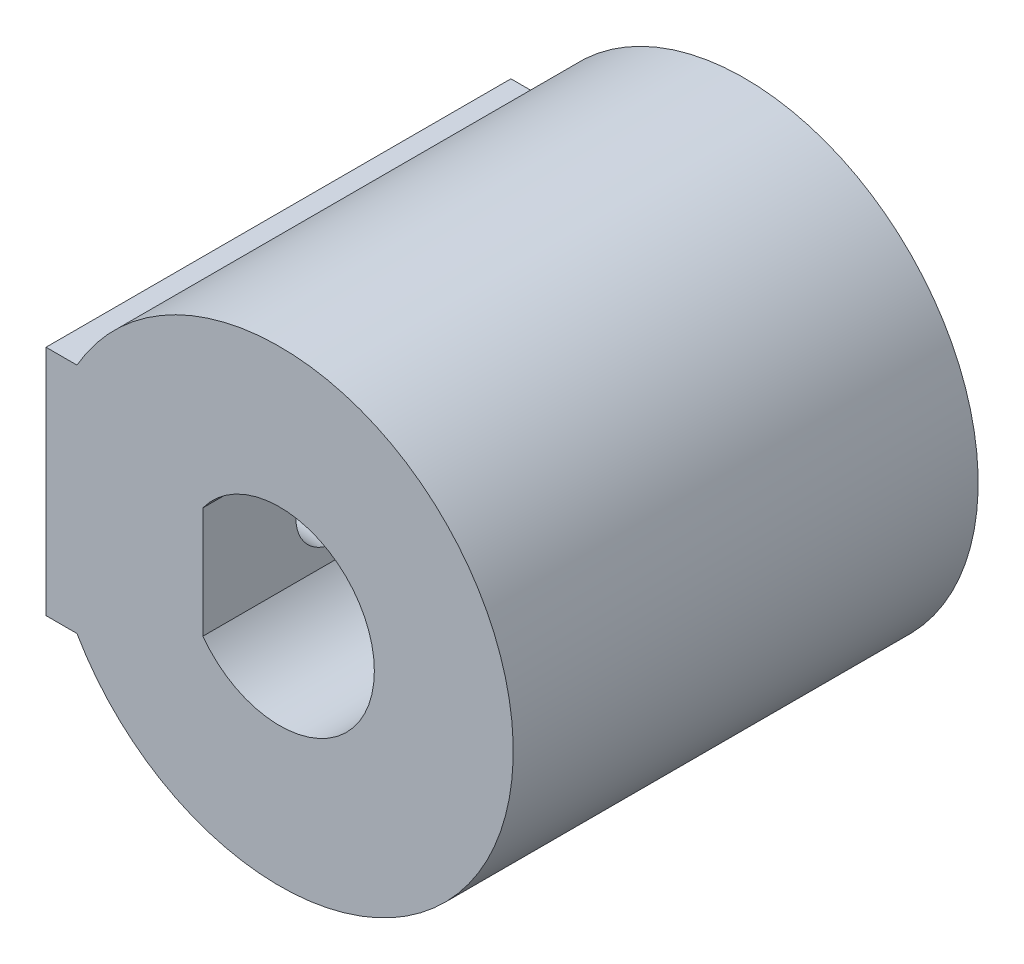
ISO-10303-21;
HEADER;
FILE_DESCRIPTION(('STEP AP214'),'2;1');
FILE_NAME('part.step','',(''),(''),'','','');
FILE_SCHEMA(('AUTOMOTIVE_DESIGN { 1 0 10303 214 1 1 1 1 }'));
ENDSEC;
DATA;
#1=APPLICATION_CONTEXT('core data for automotive mechanical design processes');
#2=APPLICATION_PROTOCOL_DEFINITION('international standard','automotive_design',2000,#1);
#3=PRODUCT_CONTEXT('',#1,'mechanical');
#4=PRODUCT('Part','Part','',(#3));
#5=PRODUCT_RELATED_PRODUCT_CATEGORY('part','',(#4));
#6=PRODUCT_DEFINITION_FORMATION('','',#4);
#7=PRODUCT_DEFINITION_CONTEXT('part definition',#1,'design');
#8=PRODUCT_DEFINITION('design','',#6,#7);
#9=PRODUCT_DEFINITION_SHAPE('','',#8);
#10=(LENGTH_UNIT() NAMED_UNIT(*) SI_UNIT(.MILLI.,.METRE.));
#11=(NAMED_UNIT(*) PLANE_ANGLE_UNIT() SI_UNIT($,.RADIAN.));
#12=(NAMED_UNIT(*) SI_UNIT($,.STERADIAN.) SOLID_ANGLE_UNIT());
#13=UNCERTAINTY_MEASURE_WITH_UNIT(LENGTH_MEASURE(1.E-05),#10,'distance_accuracy_value','');
#14=(GEOMETRIC_REPRESENTATION_CONTEXT(3) GLOBAL_UNCERTAINTY_ASSIGNED_CONTEXT((#13)) GLOBAL_UNIT_ASSIGNED_CONTEXT((#10,
#11,#12)) REPRESENTATION_CONTEXT('',''));
#15=CARTESIAN_POINT('',(0.,0.,0.));
#16=DIRECTION('',(0.,0.,1.));
#17=DIRECTION('',(1.,0.,0.));
#18=AXIS2_PLACEMENT_3D('',#15,#16,#17);
#19=CARTESIAN_POINT('',(1.6,-2.1,8.5));
#20=DIRECTION('',(1.,0.,0.));
#21=DIRECTION('',(0.,0.,-1.));
#22=AXIS2_PLACEMENT_3D('',#19,#20,#21);
#23=PLANE('',#22);
#24=DIRECTION('',(0.,1.,0.));
#25=VECTOR('',#24,1.);
#26=CARTESIAN_POINT('',(1.6,0.,3.));
#27=LINE('',#26,#25);
#28=CARTESIAN_POINT('',(1.6,-2.1,3.));
#29=VERTEX_POINT('',#28);
#30=CARTESIAN_POINT('',(1.6,2.1,3.));
#31=VERTEX_POINT('',#30);
#32=EDGE_CURVE('E188',#29,#31,#27,.T.);
#33=ORIENTED_EDGE('',*,*,#32,.F.);
#34=DIRECTION('',(0.,0.,-1.));
#35=VECTOR('',#34,1.);
#36=CARTESIAN_POINT('',(1.6,-2.1,8.5));
#37=LINE('',#36,#35);
#38=CARTESIAN_POINT('',(1.6,-2.1,8.5));
#39=VERTEX_POINT('',#38);
#40=EDGE_CURVE('E226',#39,#29,#37,.T.);
#41=ORIENTED_EDGE('',*,*,#40,.F.);
#42=DIRECTION('',(0.,-1.,0.));
#43=VECTOR('',#42,1.);
#44=CARTESIAN_POINT('',(1.6,-2.1,8.5));
#45=LINE('',#44,#43);
#46=CARTESIAN_POINT('',(1.6,2.1,8.5));
#47=VERTEX_POINT('',#46);
#48=EDGE_CURVE('E219',#47,#39,#45,.T.);
#49=ORIENTED_EDGE('',*,*,#48,.F.);
#50=DIRECTION('',(0.,0.,-1.));
#51=VECTOR('',#50,1.);
#52=CARTESIAN_POINT('',(1.6,2.1,8.5));
#53=LINE('',#52,#51);
#54=EDGE_CURVE('E229',#47,#31,#53,.T.);
#55=ORIENTED_EDGE('',*,*,#54,.T.);
#56=EDGE_LOOP('',(#33,#41,#49,#55));
#57=FACE_BOUND('',#56,.T.);
#58=ADVANCED_FACE('F44',(#57),#23,.F.);
#59=CARTESIAN_POINT('',(-1.6,2.1,8.5));
#60=DIRECTION('',(-1.,0.,0.));
#61=DIRECTION('',(0.,0.,1.));
#62=AXIS2_PLACEMENT_3D('',#59,#60,#61);
#63=PLANE('',#62);
#64=CARTESIAN_POINT('',(-1.6,0.,5.75));
#65=DIRECTION('',(-1.,0.,0.));
#66=DIRECTION('',(0.,0.,1.));
#67=AXIS2_PLACEMENT_3D('',#64,#65,#66);
#68=CIRCLE('',#67,1.75);
#69=CARTESIAN_POINT('',(-1.6,0.,7.5));
#70=VERTEX_POINT('',#69);
#71=EDGE_CURVE('E156',#70,#70,#68,.F.);
#72=ORIENTED_EDGE('',*,*,#71,.F.);
#73=EDGE_LOOP('',(#72));
#74=FACE_BOUND('',#73,.T.);
#75=DIRECTION('',(0.,-1.,0.));
#76=VECTOR('',#75,1.);
#77=CARTESIAN_POINT('',(-1.6,0.,3.));
#78=LINE('',#77,#76);
#79=CARTESIAN_POINT('',(-1.6,2.1,3.));
#80=VERTEX_POINT('',#79);
#81=CARTESIAN_POINT('',(-1.6,-2.1,3.));
#82=VERTEX_POINT('',#81);
#83=EDGE_CURVE('E203',#80,#82,#78,.T.);
#84=ORIENTED_EDGE('',*,*,#83,.F.);
#85=DIRECTION('',(0.,0.,-1.));
#86=VECTOR('',#85,1.);
#87=CARTESIAN_POINT('',(-1.6,2.1,8.5));
#88=LINE('',#87,#86);
#89=CARTESIAN_POINT('',(-1.6,2.1,8.5));
#90=VERTEX_POINT('',#89);
#91=EDGE_CURVE('E232',#90,#80,#88,.T.);
#92=ORIENTED_EDGE('',*,*,#91,.F.);
#93=DIRECTION('',(0.,1.,0.));
#94=VECTOR('',#93,1.);
#95=CARTESIAN_POINT('',(-1.6,2.1,8.5));
#96=LINE('',#95,#94);
#97=CARTESIAN_POINT('',(-1.6,-2.1,8.5));
#98=VERTEX_POINT('',#97);
#99=EDGE_CURVE('E214',#98,#90,#96,.T.);
#100=ORIENTED_EDGE('',*,*,#99,.F.);
#101=DIRECTION('',(0.,0.,-1.));
#102=VECTOR('',#101,1.);
#103=CARTESIAN_POINT('',(-1.6,-2.1,8.5));
#104=LINE('',#103,#102);
#105=EDGE_CURVE('E221',#98,#82,#104,.T.);
#106=ORIENTED_EDGE('',*,*,#105,.T.);
#107=EDGE_LOOP('',(#84,#92,#100,#106));
#108=FACE_BOUND('',#107,.T.);
#109=ADVANCED_FACE('F292',(#74,#108),#63,.F.);
#110=CARTESIAN_POINT('',(0.,0.,20.));
#111=DIRECTION('',(0.,0.,-1.));
#112=DIRECTION('',(-1.,0.,0.));
#113=AXIS2_PLACEMENT_3D('',#110,#111,#112);
#114=CYLINDRICAL_SURFACE('',#113,10.05);
#115=CARTESIAN_POINT('',(0.,0.,20.));
#116=DIRECTION('',(0.,0.,1.));
#117=DIRECTION('',(1.,0.,0.));
#118=AXIS2_PLACEMENT_3D('',#115,#116,#117);
#119=CIRCLE('',#118,10.05);
#120=CARTESIAN_POINT('',(-8.71794127073588,-5.,20.));
#121=VERTEX_POINT('',#120);
#122=CARTESIAN_POINT('',(-8.71794127073588,5.,20.));
#123=VERTEX_POINT('',#122);
#124=EDGE_CURVE('E60',#121,#123,#119,.T.);
#125=ORIENTED_EDGE('',*,*,#124,.F.);
#126=DIRECTION('',(0.,0.,-1.));
#127=VECTOR('',#126,1.);
#128=CARTESIAN_POINT('',(-8.71794127073588,-5.,20.));
#129=LINE('',#128,#127);
#130=CARTESIAN_POINT('',(-8.71794127073588,-5.,0.));
#131=VERTEX_POINT('',#130);
#132=EDGE_CURVE('E155',#131,#121,#129,.F.);
#133=ORIENTED_EDGE('',*,*,#132,.F.);
#134=CARTESIAN_POINT('',(0.,0.,0.));
#135=DIRECTION('',(0.,0.,1.));
#136=DIRECTION('',(1.,0.,0.));
#137=AXIS2_PLACEMENT_3D('',#134,#135,#136);
#138=CIRCLE('',#137,10.05);
#139=CARTESIAN_POINT('',(-8.71794127073588,5.,0.));
#140=VERTEX_POINT('',#139);
#141=EDGE_CURVE('E67',#131,#140,#138,.T.);
#142=ORIENTED_EDGE('',*,*,#141,.T.);
#143=DIRECTION('',(0.,0.,-1.));
#144=VECTOR('',#143,1.);
#145=CARTESIAN_POINT('',(-8.71794127073588,5.,20.));
#146=LINE('',#145,#144);
#147=EDGE_CURVE('E167',#123,#140,#146,.T.);
#148=ORIENTED_EDGE('',*,*,#147,.F.);
#149=EDGE_LOOP('',(#125,#133,#142,#148));
#150=FACE_BOUND('',#149,.T.);
#151=ADVANCED_FACE('F328',(#150),#114,.T.);
#152=CARTESIAN_POINT('',(0.,0.,20.));
#153=DIRECTION('',(0.,0.,1.));
#154=DIRECTION('',(1.,0.,0.));
#155=AXIS2_PLACEMENT_3D('',#152,#153,#154);
#156=PLANE('',#155);
#157=DIRECTION('',(0.,-1.,0.));
#158=VECTOR('',#157,1.);
#159=CARTESIAN_POINT('',(-3.3,0.,20.));
#160=LINE('',#159,#158);
#161=CARTESIAN_POINT('',(-3.3,2.39073733396206,20.));
#162=VERTEX_POINT('',#161);
#163=CARTESIAN_POINT('',(-3.3,-2.39073733396206,20.));
#164=VERTEX_POINT('',#163);
#165=EDGE_CURVE('E172',#162,#164,#160,.T.);
#166=ORIENTED_EDGE('',*,*,#165,.F.);
#167=CARTESIAN_POINT('',(0.,0.,20.));
#168=DIRECTION('',(0.,0.,1.));
#169=DIRECTION('',(1.,0.,0.));
#170=AXIS2_PLACEMENT_3D('',#167,#168,#169);
#171=CIRCLE('',#170,4.075);
#172=EDGE_CURVE('E179',#164,#162,#171,.T.);
#173=ORIENTED_EDGE('',*,*,#172,.F.);
#174=EDGE_LOOP('',(#166,#173));
#175=FACE_BOUND('',#174,.T.);
#176=DIRECTION('',(0.,1.,0.));
#177=VECTOR('',#176,1.);
#178=CARTESIAN_POINT('',(-10.05,5.,20.));
#179=LINE('',#178,#177);
#180=CARTESIAN_POINT('',(-10.05,-5.,20.));
#181=VERTEX_POINT('',#180);
#182=CARTESIAN_POINT('',(-10.05,5.,20.));
#183=VERTEX_POINT('',#182);
#184=EDGE_CURVE('E145',#181,#183,#179,.T.);
#185=ORIENTED_EDGE('',*,*,#184,.F.);
#186=DIRECTION('',(-1.,0.,0.));
#187=VECTOR('',#186,1.);
#188=CARTESIAN_POINT('',(10.051,-5.,20.));
#189=LINE('',#188,#187);
#190=EDGE_CURVE('E151',#121,#181,#189,.T.);
#191=ORIENTED_EDGE('',*,*,#190,.F.);
#192=ORIENTED_EDGE('',*,*,#124,.T.);
#193=DIRECTION('',(-1.,0.,0.));
#194=VECTOR('',#193,1.);
#195=CARTESIAN_POINT('',(10.051,5.,20.));
#196=LINE('',#195,#194);
#197=EDGE_CURVE('E165',#123,#183,#196,.T.);
#198=ORIENTED_EDGE('',*,*,#197,.T.);
#199=EDGE_LOOP('',(#185,#191,#192,#198));
#200=FACE_BOUND('',#199,.T.);
#201=ADVANCED_FACE('F335',(#175,#200),#156,.T.);
#202=CARTESIAN_POINT('',(0.,0.,0.));
#203=DIRECTION('',(0.,0.,1.));
#204=DIRECTION('',(1.,0.,0.));
#205=AXIS2_PLACEMENT_3D('',#202,#203,#204);
#206=PLANE('',#205);
#207=CARTESIAN_POINT('',(0.,0.0748563170931541,0.));
#208=DIRECTION('',(0.,0.,-1.));
#209=DIRECTION('',(1.,0.,0.));
#210=AXIS2_PLACEMENT_3D('',#207,#208,#209);
#211=CIRCLE('',#210,2.7);
#212=CARTESIAN_POINT('',(1.6,-2.1,0.));
#213=VERTEX_POINT('',#212);
#214=CARTESIAN_POINT('',(-1.6,-2.1,0.));
#215=VERTEX_POINT('',#214);
#216=EDGE_CURVE('E201',#213,#215,#211,.T.);
#217=ORIENTED_EDGE('',*,*,#216,.F.);
#218=CARTESIAN_POINT('',(0.,0.,0.));
#219=DIRECTION('',(0.,0.,-1.));
#220=DIRECTION('',(-1.,0.,0.));
#221=AXIS2_PLACEMENT_3D('',#218,#219,#220);
#222=CIRCLE('',#221,2.64007575648882);
#223=CARTESIAN_POINT('',(1.6,2.1,0.));
#224=VERTEX_POINT('',#223);
#225=EDGE_CURVE('E192',#224,#213,#222,.T.);
#226=ORIENTED_EDGE('',*,*,#225,.F.);
#227=CARTESIAN_POINT('',(0.,-0.0748563170931541,0.));
#228=DIRECTION('',(0.,0.,-1.));
#229=DIRECTION('',(1.,0.,0.));
#230=AXIS2_PLACEMENT_3D('',#227,#228,#229);
#231=CIRCLE('',#230,2.7);
#232=CARTESIAN_POINT('',(-1.6,2.1,0.));
#233=VERTEX_POINT('',#232);
#234=EDGE_CURVE('E215',#233,#224,#231,.T.);
#235=ORIENTED_EDGE('',*,*,#234,.F.);
#236=CARTESIAN_POINT('',(0.,0.,0.));
#237=DIRECTION('',(0.,0.,-1.));
#238=DIRECTION('',(-1.,0.,0.));
#239=AXIS2_PLACEMENT_3D('',#236,#237,#238);
#240=CIRCLE('',#239,2.64007575648882);
#241=EDGE_CURVE('E187',#215,#233,#240,.T.);
#242=ORIENTED_EDGE('',*,*,#241,.F.);
#243=EDGE_LOOP('',(#217,#226,#235,#242));
#244=FACE_BOUND('',#243,.T.);
#245=ORIENTED_EDGE('',*,*,#141,.F.);
#246=DIRECTION('',(-1.,0.,0.));
#247=VECTOR('',#246,1.);
#248=CARTESIAN_POINT('',(10.051,-5.,0.));
#249=LINE('',#248,#247);
#250=CARTESIAN_POINT('',(-10.05,-5.,0.));
#251=VERTEX_POINT('',#250);
#252=EDGE_CURVE('E146',#131,#251,#249,.T.);
#253=ORIENTED_EDGE('',*,*,#252,.T.);
#254=DIRECTION('',(0.,-1.,0.));
#255=VECTOR('',#254,1.);
#256=CARTESIAN_POINT('',(-10.05,-5.,0.));
#257=LINE('',#256,#255);
#258=CARTESIAN_POINT('',(-10.05,5.,0.));
#259=VERTEX_POINT('',#258);
#260=EDGE_CURVE('E136',#259,#251,#257,.T.);
#261=ORIENTED_EDGE('',*,*,#260,.F.);
#262=DIRECTION('',(-1.,0.,0.));
#263=VECTOR('',#262,1.);
#264=CARTESIAN_POINT('',(10.051,5.,0.));
#265=LINE('',#264,#263);
#266=EDGE_CURVE('E170',#140,#259,#265,.T.);
#267=ORIENTED_EDGE('',*,*,#266,.F.);
#268=EDGE_LOOP('',(#245,#253,#261,#267));
#269=FACE_BOUND('',#268,.T.);
#270=ADVANCED_FACE('F148',(#244,#269),#206,.F.);
#271=CARTESIAN_POINT('',(0.,0.0748563170931541,8.5));
#272=DIRECTION('',(0.,0.,-1.));
#273=DIRECTION('',(-1.,0.,0.));
#274=AXIS2_PLACEMENT_3D('',#271,#272,#273);
#275=CYLINDRICAL_SURFACE('',#274,2.7);
#276=ORIENTED_EDGE('',*,*,#216,.T.);
#277=DIRECTION('',(0.,0.,-1.));
#278=VECTOR('',#277,1.);
#279=CARTESIAN_POINT('',(-1.6,-2.1,3.));
#280=LINE('',#279,#278);
#281=EDGE_CURVE('E207',#82,#215,#280,.T.);
#282=ORIENTED_EDGE('',*,*,#281,.F.);
#283=ORIENTED_EDGE('',*,*,#105,.F.);
#284=CARTESIAN_POINT('',(0.,0.0748563170931541,8.5));
#285=DIRECTION('',(0.,0.,-1.));
#286=DIRECTION('',(1.,0.,0.));
#287=AXIS2_PLACEMENT_3D('',#284,#285,#286);
#288=CIRCLE('',#287,2.7);
#289=EDGE_CURVE('E212',#39,#98,#288,.T.);
#290=ORIENTED_EDGE('',*,*,#289,.F.);
#291=ORIENTED_EDGE('',*,*,#40,.T.);
#292=DIRECTION('',(0.,0.,-1.));
#293=VECTOR('',#292,1.);
#294=CARTESIAN_POINT('',(1.6,-2.1,3.));
#295=LINE('',#294,#293);
#296=EDGE_CURVE('E198',#29,#213,#295,.T.);
#297=ORIENTED_EDGE('',*,*,#296,.T.);
#298=EDGE_LOOP('',(#276,#282,#283,#290,#291,#297));
#299=FACE_BOUND('',#298,.T.);
#300=ADVANCED_FACE('F289',(#299),#275,.F.);
#301=CARTESIAN_POINT('',(0.,-0.0748563170931541,8.5));
#302=DIRECTION('',(0.,0.,-1.));
#303=DIRECTION('',(-1.,0.,0.));
#304=AXIS2_PLACEMENT_3D('',#301,#302,#303);
#305=CYLINDRICAL_SURFACE('',#304,2.7);
#306=ORIENTED_EDGE('',*,*,#234,.T.);
#307=DIRECTION('',(0.,0.,-1.));
#308=VECTOR('',#307,1.);
#309=CARTESIAN_POINT('',(1.6,2.1,3.));
#310=LINE('',#309,#308);
#311=EDGE_CURVE('E195',#31,#224,#310,.T.);
#312=ORIENTED_EDGE('',*,*,#311,.F.);
#313=ORIENTED_EDGE('',*,*,#54,.F.);
#314=CARTESIAN_POINT('',(0.,-0.0748563170931541,8.5));
#315=DIRECTION('',(0.,0.,-1.));
#316=DIRECTION('',(1.,0.,0.));
#317=AXIS2_PLACEMENT_3D('',#314,#315,#316);
#318=CIRCLE('',#317,2.7);
#319=EDGE_CURVE('E217',#90,#47,#318,.T.);
#320=ORIENTED_EDGE('',*,*,#319,.F.);
#321=ORIENTED_EDGE('',*,*,#91,.T.);
#322=DIRECTION('',(0.,0.,-1.));
#323=VECTOR('',#322,1.);
#324=CARTESIAN_POINT('',(-1.6,2.1,3.));
#325=LINE('',#324,#323);
#326=EDGE_CURVE('E197',#80,#233,#325,.T.);
#327=ORIENTED_EDGE('',*,*,#326,.T.);
#328=EDGE_LOOP('',(#306,#312,#313,#320,#321,#327));
#329=FACE_BOUND('',#328,.T.);
#330=ADVANCED_FACE('F296',(#329),#305,.F.);
#331=CARTESIAN_POINT('',(0.,0.,3.));
#332=DIRECTION('',(0.,0.,-1.));
#333=DIRECTION('',(-1.,0.,0.));
#334=AXIS2_PLACEMENT_3D('',#331,#332,#333);
#335=CYLINDRICAL_SURFACE('',#334,2.64007575648882);
#336=ORIENTED_EDGE('',*,*,#241,.T.);
#337=ORIENTED_EDGE('',*,*,#326,.F.);
#338=CARTESIAN_POINT('',(0.,0.,3.));
#339=DIRECTION('',(0.,0.,-1.));
#340=DIRECTION('',(-1.,0.,0.));
#341=AXIS2_PLACEMENT_3D('',#338,#339,#340);
#342=CIRCLE('',#341,2.64007575648882);
#343=EDGE_CURVE('E205',#82,#80,#342,.T.);
#344=ORIENTED_EDGE('',*,*,#343,.F.);
#345=ORIENTED_EDGE('',*,*,#281,.T.);
#346=EDGE_LOOP('',(#336,#337,#344,#345));
#347=FACE_BOUND('',#346,.T.);
#348=ADVANCED_FACE('F308',(#347),#335,.F.);
#349=CARTESIAN_POINT('',(0.,0.,3.));
#350=DIRECTION('',(0.,0.,-1.));
#351=DIRECTION('',(-1.,0.,0.));
#352=AXIS2_PLACEMENT_3D('',#349,#350,#351);
#353=PLANE('',#352);
#354=ORIENTED_EDGE('',*,*,#83,.T.);
#355=ORIENTED_EDGE('',*,*,#343,.T.);
#356=EDGE_LOOP('',(#354,#355));
#357=FACE_BOUND('',#356,.T.);
#358=ADVANCED_FACE('F311',(#357),#353,.T.);
#359=CARTESIAN_POINT('',(0.,0.,3.));
#360=DIRECTION('',(0.,0.,-1.));
#361=DIRECTION('',(-1.,0.,0.));
#362=AXIS2_PLACEMENT_3D('',#359,#360,#361);
#363=CYLINDRICAL_SURFACE('',#362,2.64007575648882);
#364=ORIENTED_EDGE('',*,*,#225,.T.);
#365=ORIENTED_EDGE('',*,*,#296,.F.);
#366=CARTESIAN_POINT('',(0.,0.,3.));
#367=DIRECTION('',(0.,0.,-1.));
#368=DIRECTION('',(-1.,0.,0.));
#369=AXIS2_PLACEMENT_3D('',#366,#367,#368);
#370=CIRCLE('',#369,2.64007575648882);
#371=EDGE_CURVE('E191',#31,#29,#370,.T.);
#372=ORIENTED_EDGE('',*,*,#371,.F.);
#373=ORIENTED_EDGE('',*,*,#311,.T.);
#374=EDGE_LOOP('',(#364,#365,#372,#373));
#375=FACE_BOUND('',#374,.T.);
#376=ADVANCED_FACE('F313',(#375),#363,.F.);
#377=CARTESIAN_POINT('',(0.,0.,3.));
#378=DIRECTION('',(0.,0.,-1.));
#379=DIRECTION('',(-1.,0.,0.));
#380=AXIS2_PLACEMENT_3D('',#377,#378,#379);
#381=PLANE('',#380);
#382=ORIENTED_EDGE('',*,*,#32,.T.);
#383=ORIENTED_EDGE('',*,*,#371,.T.);
#384=EDGE_LOOP('',(#382,#383));
#385=FACE_BOUND('',#384,.T.);
#386=ADVANCED_FACE('F279',(#385),#381,.T.);
#387=CARTESIAN_POINT('',(0.,0.0748563170931541,8.5));
#388=DIRECTION('',(0.,0.,1.));
#389=DIRECTION('',(1.,0.,0.));
#390=AXIS2_PLACEMENT_3D('',#387,#388,#389);
#391=PLANE('',#390);
#392=DIRECTION('',(0.,1.,0.));
#393=VECTOR('',#392,1.);
#394=CARTESIAN_POINT('',(-3.3,0.,8.5));
#395=LINE('',#394,#393);
#396=CARTESIAN_POINT('',(-3.3,-2.39073733396206,8.5));
#397=VERTEX_POINT('',#396);
#398=CARTESIAN_POINT('',(-3.3,2.39073733396206,8.5));
#399=VERTEX_POINT('',#398);
#400=EDGE_CURVE('E174',#397,#399,#395,.T.);
#401=ORIENTED_EDGE('',*,*,#400,.F.);
#402=CARTESIAN_POINT('',(0.,0.,8.5));
#403=DIRECTION('',(0.,0.,1.));
#404=DIRECTION('',(1.,0.,0.));
#405=AXIS2_PLACEMENT_3D('',#402,#403,#404);
#406=CIRCLE('',#405,4.075);
#407=EDGE_CURVE('E176',#399,#397,#406,.F.);
#408=ORIENTED_EDGE('',*,*,#407,.F.);
#409=EDGE_LOOP('',(#401,#408));
#410=FACE_BOUND('',#409,.T.);
#411=ORIENTED_EDGE('',*,*,#289,.T.);
#412=ORIENTED_EDGE('',*,*,#99,.T.);
#413=ORIENTED_EDGE('',*,*,#319,.T.);
#414=ORIENTED_EDGE('',*,*,#48,.T.);
#415=EDGE_LOOP('',(#411,#412,#413,#414));
#416=FACE_BOUND('',#415,.T.);
#417=ADVANCED_FACE('F267',(#410,#416),#391,.T.);
#418=CARTESIAN_POINT('',(-3.3,0.,-2.49150239958124));
#419=DIRECTION('',(-1.,0.,0.));
#420=DIRECTION('',(0.,0.,1.));
#421=AXIS2_PLACEMENT_3D('',#418,#419,#420);
#422=PLANE('',#421);
#423=CARTESIAN_POINT('',(-3.3,0.,14.25));
#424=DIRECTION('',(-1.,0.,0.));
#425=DIRECTION('',(0.,0.,1.));
#426=AXIS2_PLACEMENT_3D('',#423,#424,#425);
#427=CIRCLE('',#426,1.75);
#428=CARTESIAN_POINT('',(-3.3,0.,16.));
#429=VERTEX_POINT('',#428);
#430=EDGE_CURVE('E160',#429,#429,#427,.T.);
#431=ORIENTED_EDGE('',*,*,#430,.T.);
#432=EDGE_LOOP('',(#431));
#433=FACE_BOUND('',#432,.T.);
#434=ORIENTED_EDGE('',*,*,#400,.T.);
#435=DIRECTION('',(0.,0.,1.));
#436=VECTOR('',#435,1.);
#437=CARTESIAN_POINT('',(-3.3,2.39073733396206,-2.49150239958124));
#438=LINE('',#437,#436);
#439=EDGE_CURVE('E177',#399,#162,#438,.T.);
#440=ORIENTED_EDGE('',*,*,#439,.T.);
#441=ORIENTED_EDGE('',*,*,#165,.T.);
#442=DIRECTION('',(0.,0.,1.));
#443=VECTOR('',#442,1.);
#444=CARTESIAN_POINT('',(-3.3,-2.39073733396206,-2.49150239958124));
#445=LINE('',#444,#443);
#446=EDGE_CURVE('E182',#397,#164,#445,.T.);
#447=ORIENTED_EDGE('',*,*,#446,.F.);
#448=EDGE_LOOP('',(#434,#440,#441,#447));
#449=FACE_BOUND('',#448,.T.);
#450=ADVANCED_FACE('F263',(#433,#449),#422,.F.);
#451=CARTESIAN_POINT('',(0.,0.,-2.49150239958124));
#452=DIRECTION('',(0.,0.,1.));
#453=DIRECTION('',(1.,0.,0.));
#454=AXIS2_PLACEMENT_3D('',#451,#452,#453);
#455=CYLINDRICAL_SURFACE('',#454,4.075);
#456=ORIENTED_EDGE('',*,*,#407,.T.);
#457=ORIENTED_EDGE('',*,*,#446,.T.);
#458=ORIENTED_EDGE('',*,*,#172,.T.);
#459=ORIENTED_EDGE('',*,*,#439,.F.);
#460=EDGE_LOOP('',(#456,#457,#458,#459));
#461=FACE_BOUND('',#460,.T.);
#462=ADVANCED_FACE('F266',(#461),#455,.F.);
#463=CARTESIAN_POINT('',(-10.05,0.,0.));
#464=DIRECTION('',(1.,0.,0.));
#465=DIRECTION('',(0.,0.,-1.));
#466=AXIS2_PLACEMENT_3D('',#463,#464,#465);
#467=PLANE('',#466);
#468=CARTESIAN_POINT('',(-10.05,0.,14.25));
#469=DIRECTION('',(1.,0.,0.));
#470=DIRECTION('',(0.,0.,-1.));
#471=AXIS2_PLACEMENT_3D('',#468,#469,#470);
#472=CIRCLE('',#471,2.25);
#473=CARTESIAN_POINT('',(-10.05,0.,12.));
#474=VERTEX_POINT('',#473);
#475=EDGE_CURVE('E53',#474,#474,#472,.T.);
#476=ORIENTED_EDGE('',*,*,#475,.T.);
#477=EDGE_LOOP('',(#476));
#478=FACE_BOUND('',#477,.T.);
#479=CARTESIAN_POINT('',(-10.05,0.,5.75));
#480=DIRECTION('',(1.,0.,0.));
#481=DIRECTION('',(0.,0.,-1.));
#482=AXIS2_PLACEMENT_3D('',#479,#480,#481);
#483=CIRCLE('',#482,2.25000000000001);
#484=CARTESIAN_POINT('',(-10.05,0.,3.49999999999999));
#485=VERTEX_POINT('',#484);
#486=EDGE_CURVE('E242',#485,#485,#483,.T.);
#487=ORIENTED_EDGE('',*,*,#486,.T.);
#488=EDGE_LOOP('',(#487));
#489=FACE_BOUND('',#488,.T.);
#490=ORIENTED_EDGE('',*,*,#260,.T.);
#491=DIRECTION('',(0.,0.,1.));
#492=VECTOR('',#491,1.);
#493=CARTESIAN_POINT('',(-10.05,-5.,20.));
#494=LINE('',#493,#492);
#495=EDGE_CURVE('E141',#251,#181,#494,.T.);
#496=ORIENTED_EDGE('',*,*,#495,.T.);
#497=ORIENTED_EDGE('',*,*,#184,.T.);
#498=DIRECTION('',(0.,0.,-1.));
#499=VECTOR('',#498,1.);
#500=CARTESIAN_POINT('',(-10.05,5.,0.));
#501=LINE('',#500,#499);
#502=EDGE_CURVE('E143',#183,#259,#501,.T.);
#503=ORIENTED_EDGE('',*,*,#502,.T.);
#504=EDGE_LOOP('',(#490,#496,#497,#503));
#505=FACE_BOUND('',#504,.T.);
#506=ADVANCED_FACE('F138',(#478,#489,#505),#467,.F.);
#507=CARTESIAN_POINT('',(10.051,5.,0.));
#508=DIRECTION('',(0.,1.,0.));
#509=DIRECTION('',(0.,0.,1.));
#510=AXIS2_PLACEMENT_3D('',#507,#508,#509);
#511=PLANE('',#510);
#512=ORIENTED_EDGE('',*,*,#197,.F.);
#513=ORIENTED_EDGE('',*,*,#147,.T.);
#514=ORIENTED_EDGE('',*,*,#266,.T.);
#515=ORIENTED_EDGE('',*,*,#502,.F.);
#516=EDGE_LOOP('',(#512,#513,#514,#515));
#517=FACE_BOUND('',#516,.T.);
#518=ADVANCED_FACE('F351',(#517),#511,.T.);
#519=CARTESIAN_POINT('',(10.051,-5.,20.));
#520=DIRECTION('',(0.,-1.,0.));
#521=DIRECTION('',(0.,0.,-1.));
#522=AXIS2_PLACEMENT_3D('',#519,#520,#521);
#523=PLANE('',#522);
#524=ORIENTED_EDGE('',*,*,#252,.F.);
#525=ORIENTED_EDGE('',*,*,#132,.T.);
#526=ORIENTED_EDGE('',*,*,#190,.T.);
#527=ORIENTED_EDGE('',*,*,#495,.F.);
#528=EDGE_LOOP('',(#524,#525,#526,#527));
#529=FACE_BOUND('',#528,.T.);
#530=ADVANCED_FACE('F154',(#529),#523,.T.);
#531=CARTESIAN_POINT('',(3.34974746830583,0.,5.75));
#532=DIRECTION('',(-1.,0.,0.));
#533=DIRECTION('',(0.,0.,1.));
#534=AXIS2_PLACEMENT_3D('',#531,#532,#533);
#535=CYLINDRICAL_SURFACE('',#534,1.75);
#536=CARTESIAN_POINT('',(-9.55,0.,5.75));
#537=DIRECTION('',(1.,0.,0.));
#538=DIRECTION('',(0.,0.,-1.));
#539=AXIS2_PLACEMENT_3D('',#536,#537,#538);
#540=CIRCLE('',#539,1.75);
#541=CARTESIAN_POINT('',(-9.55,0.,4.));
#542=VERTEX_POINT('',#541);
#543=EDGE_CURVE('E11',#542,#542,#540,.F.);
#544=ORIENTED_EDGE('',*,*,#543,.T.);
#545=EDGE_LOOP('',(#544));
#546=FACE_BOUND('',#545,.T.);
#547=ORIENTED_EDGE('',*,*,#71,.T.);
#548=EDGE_LOOP('',(#547));
#549=FACE_BOUND('',#548,.T.);
#550=ADVANCED_FACE('F257',(#546,#549),#535,.F.);
#551=CARTESIAN_POINT('',(10.051,0.,14.25));
#552=DIRECTION('',(-1.,0.,0.));
#553=DIRECTION('',(0.,0.,1.));
#554=AXIS2_PLACEMENT_3D('',#551,#552,#553);
#555=CYLINDRICAL_SURFACE('',#554,1.75);
#556=CARTESIAN_POINT('',(-9.55,0.,14.25));
#557=DIRECTION('',(1.,0.,0.));
#558=DIRECTION('',(0.,0.,-1.));
#559=AXIS2_PLACEMENT_3D('',#556,#557,#558);
#560=CIRCLE('',#559,1.75);
#561=CARTESIAN_POINT('',(-9.55,0.,12.5));
#562=VERTEX_POINT('',#561);
#563=EDGE_CURVE('E238',#562,#562,#560,.F.);
#564=ORIENTED_EDGE('',*,*,#563,.T.);
#565=EDGE_LOOP('',(#564));
#566=FACE_BOUND('',#565,.T.);
#567=ORIENTED_EDGE('',*,*,#430,.F.);
#568=EDGE_LOOP('',(#567));
#569=FACE_BOUND('',#568,.T.);
#570=ADVANCED_FACE('F252',(#566,#569),#555,.F.);
#571=CARTESIAN_POINT('',(-9.55,0.,14.25));
#572=DIRECTION('',(-1.,0.,0.));
#573=DIRECTION('',(0.,0.,1.));
#574=AXIS2_PLACEMENT_3D('',#571,#572,#573);
#575=CONICAL_SURFACE('',#574,1.75,0.785398163397448);
#576=ORIENTED_EDGE('',*,*,#475,.F.);
#577=EDGE_LOOP('',(#576));
#578=FACE_BOUND('',#577,.T.);
#579=ORIENTED_EDGE('',*,*,#563,.F.);
#580=EDGE_LOOP('',(#579));
#581=FACE_BOUND('',#580,.T.);
#582=ADVANCED_FACE('F249',(#578,#581),#575,.F.);
#583=CARTESIAN_POINT('',(-9.55,0.,5.75));
#584=DIRECTION('',(-1.,0.,0.));
#585=DIRECTION('',(0.,0.,1.));
#586=AXIS2_PLACEMENT_3D('',#583,#584,#585);
#587=CONICAL_SURFACE('',#586,1.75,0.78539816339745);
#588=ORIENTED_EDGE('',*,*,#486,.F.);
#589=EDGE_LOOP('',(#588));
#590=FACE_BOUND('',#589,.T.);
#591=ORIENTED_EDGE('',*,*,#543,.F.);
#592=EDGE_LOOP('',(#591));
#593=FACE_BOUND('',#592,.T.);
#594=ADVANCED_FACE('F47',(#590,#593),#587,.F.);
#595=CLOSED_SHELL('',(#58,#109,#151,#201,#270,#300,#330,#348,#358,#376,#386,#417,#450,#462,#506,
#518,#530,#550,#570,#582,#594));
#596=MANIFOLD_SOLID_BREP('B2',#595);
#597=ADVANCED_BREP_SHAPE_REPRESENTATION('',(#18,#596),#14);
#598=SHAPE_DEFINITION_REPRESENTATION(#9,#597);
ENDSEC;
END-ISO-10303-21;
